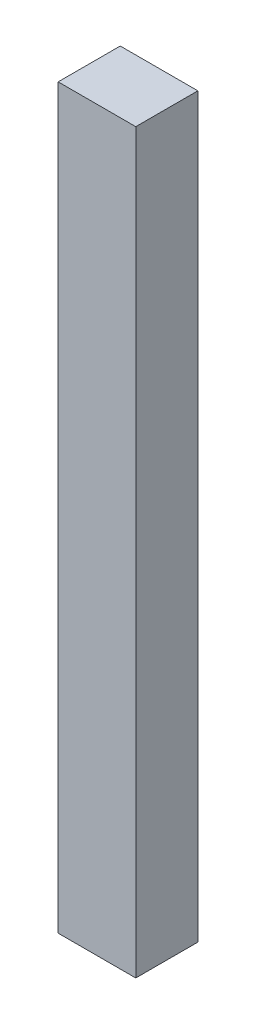
ISO-10303-21;
HEADER;
FILE_DESCRIPTION(('STEP AP214'),'2;1');
FILE_NAME('part.step','',(''),(''),'','','');
FILE_SCHEMA(('AUTOMOTIVE_DESIGN { 1 0 10303 214 1 1 1 1 }'));
ENDSEC;
DATA;
#1=APPLICATION_CONTEXT('core data for automotive mechanical design processes');
#2=APPLICATION_PROTOCOL_DEFINITION('international standard','automotive_design',2000,#1);
#3=PRODUCT_CONTEXT('',#1,'mechanical');
#4=PRODUCT('Part','Part','',(#3));
#5=PRODUCT_RELATED_PRODUCT_CATEGORY('part','',(#4));
#6=PRODUCT_DEFINITION_FORMATION('','',#4);
#7=PRODUCT_DEFINITION_CONTEXT('part definition',#1,'design');
#8=PRODUCT_DEFINITION('design','',#6,#7);
#9=PRODUCT_DEFINITION_SHAPE('','',#8);
#10=(LENGTH_UNIT() NAMED_UNIT(*) SI_UNIT(.MILLI.,.METRE.));
#11=(NAMED_UNIT(*) PLANE_ANGLE_UNIT() SI_UNIT($,.RADIAN.));
#12=(NAMED_UNIT(*) SI_UNIT($,.STERADIAN.) SOLID_ANGLE_UNIT());
#13=UNCERTAINTY_MEASURE_WITH_UNIT(LENGTH_MEASURE(1.E-05),#10,'distance_accuracy_value','');
#14=(GEOMETRIC_REPRESENTATION_CONTEXT(3) GLOBAL_UNCERTAINTY_ASSIGNED_CONTEXT((#13)) GLOBAL_UNIT_ASSIGNED_CONTEXT((#10,
#11,#12)) REPRESENTATION_CONTEXT('',''));
#15=CARTESIAN_POINT('',(0.,0.,0.));
#16=DIRECTION('',(0.,0.,1.));
#17=DIRECTION('',(1.,0.,0.));
#18=AXIS2_PLACEMENT_3D('',#15,#16,#17);
#19=CARTESIAN_POINT('',(-10.5586380739637,2.320984547896,3.540984547896));
#20=DIRECTION('',(0.,0.,-1.));
#21=DIRECTION('',(0.,1.,0.));
#22=AXIS2_PLACEMENT_3D('',#19,#20,#21);
#23=PLANE('',#22);
#24=DIRECTION('',(0.,1.,0.));
#25=VECTOR('',#24,1.);
#26=CARTESIAN_POINT('',(-10.1386380739637,2.130984547896,3.540984547896));
#27=LINE('',#26,#25);
#28=CARTESIAN_POINT('',(-10.1386380739637,-1.669015452104,3.540984547896));
#29=VERTEX_POINT('',#28);
#30=CARTESIAN_POINT('',(-10.1386380739637,2.130984547896,3.540984547896));
#31=VERTEX_POINT('',#30);
#32=EDGE_CURVE('E80',#29,#31,#27,.T.);
#33=ORIENTED_EDGE('',*,*,#32,.F.);
#34=DIRECTION('',(1.,0.,0.));
#35=VECTOR('',#34,1.);
#36=CARTESIAN_POINT('',(-10.1386380739637,-1.669015452104,3.540984547896));
#37=LINE('',#36,#35);
#38=CARTESIAN_POINT('',(-10.5386380739637,-1.669015452104,3.540984547896));
#39=VERTEX_POINT('',#38);
#40=EDGE_CURVE('E68',#39,#29,#37,.T.);
#41=ORIENTED_EDGE('',*,*,#40,.F.);
#42=DIRECTION('',(0.,-1.,0.));
#43=VECTOR('',#42,1.);
#44=CARTESIAN_POINT('',(-10.5386380739637,-1.669015452104,3.540984547896));
#45=LINE('',#44,#43);
#46=CARTESIAN_POINT('',(-10.5386380739637,2.130984547896,3.540984547896));
#47=VERTEX_POINT('',#46);
#48=EDGE_CURVE('E55',#47,#39,#45,.T.);
#49=ORIENTED_EDGE('',*,*,#48,.F.);
#50=DIRECTION('',(1.,0.,0.));
#51=VECTOR('',#50,1.);
#52=CARTESIAN_POINT('',(-10.5386380739637,2.130984547896,3.540984547896));
#53=LINE('',#52,#51);
#54=EDGE_CURVE('E20',#31,#47,#53,.F.);
#55=ORIENTED_EDGE('',*,*,#54,.F.);
#56=EDGE_LOOP('',(#33,#41,#49,#55));
#57=FACE_BOUND('',#56,.T.);
#58=ADVANCED_FACE('F17',(#57),#23,.T.);
#59=CARTESIAN_POINT('',(-10.5386380739637,2.130984547896,3.860984547896));
#60=DIRECTION('',(0.,1.,0.));
#61=DIRECTION('',(0.,0.,1.));
#62=AXIS2_PLACEMENT_3D('',#59,#60,#61);
#63=PLANE('',#62);
#64=ORIENTED_EDGE('',*,*,#54,.T.);
#65=DIRECTION('',(0.,0.,1.));
#66=VECTOR('',#65,1.);
#67=CARTESIAN_POINT('',(-10.5386380739637,2.130984547896,3.860984547896));
#68=LINE('',#67,#66);
#69=CARTESIAN_POINT('',(-10.5386380739637,2.130984547896,3.860984547896));
#70=VERTEX_POINT('',#69);
#71=EDGE_CURVE('E61',#70,#47,#68,.F.);
#72=ORIENTED_EDGE('',*,*,#71,.F.);
#73=DIRECTION('',(1.,0.,0.));
#74=VECTOR('',#73,1.);
#75=CARTESIAN_POINT('',(-10.5586380739637,2.130984547896,3.860984547896));
#76=LINE('',#75,#74);
#77=CARTESIAN_POINT('',(-10.1386380739637,2.130984547896,3.860984547896));
#78=VERTEX_POINT('',#77);
#79=EDGE_CURVE('E83',#78,#70,#76,.F.);
#80=ORIENTED_EDGE('',*,*,#79,.F.);
#81=DIRECTION('',(0.,0.,1.));
#82=VECTOR('',#81,1.);
#83=CARTESIAN_POINT('',(-10.1386380739637,2.130984547896,3.860984547896));
#84=LINE('',#83,#82);
#85=EDGE_CURVE('E64',#31,#78,#84,.T.);
#86=ORIENTED_EDGE('',*,*,#85,.F.);
#87=EDGE_LOOP('',(#64,#72,#80,#86));
#88=FACE_BOUND('',#87,.T.);
#89=ADVANCED_FACE('F60',(#88),#63,.T.);
#90=CARTESIAN_POINT('',(-10.5386380739637,-1.669015452104,3.860984547896));
#91=DIRECTION('',(-1.,0.,0.));
#92=DIRECTION('',(0.,-1.,0.));
#93=AXIS2_PLACEMENT_3D('',#90,#91,#92);
#94=PLANE('',#93);
#95=ORIENTED_EDGE('',*,*,#48,.T.);
#96=DIRECTION('',(0.,0.,-1.));
#97=VECTOR('',#96,1.);
#98=CARTESIAN_POINT('',(-10.5386380739637,-1.669015452104,3.860984547896));
#99=LINE('',#98,#97);
#100=CARTESIAN_POINT('',(-10.5386380739637,-1.669015452104,3.860984547896));
#101=VERTEX_POINT('',#100);
#102=EDGE_CURVE('E70',#101,#39,#99,.T.);
#103=ORIENTED_EDGE('',*,*,#102,.F.);
#104=DIRECTION('',(0.,-1.,0.));
#105=VECTOR('',#104,1.);
#106=CARTESIAN_POINT('',(-10.5386380739637,-1.859015452104,3.860984547896));
#107=LINE('',#106,#105);
#108=EDGE_CURVE('E74',#70,#101,#107,.T.);
#109=ORIENTED_EDGE('',*,*,#108,.F.);
#110=ORIENTED_EDGE('',*,*,#71,.T.);
#111=EDGE_LOOP('',(#95,#103,#109,#110));
#112=FACE_BOUND('',#111,.T.);
#113=ADVANCED_FACE('F72',(#112),#94,.T.);
#114=CARTESIAN_POINT('',(-10.1386380739637,-1.669015452104,3.860984547896));
#115=DIRECTION('',(0.,-1.,0.));
#116=DIRECTION('',(0.,0.,-1.));
#117=AXIS2_PLACEMENT_3D('',#114,#115,#116);
#118=PLANE('',#117);
#119=ORIENTED_EDGE('',*,*,#40,.T.);
#120=DIRECTION('',(0.,0.,1.));
#121=VECTOR('',#120,1.);
#122=CARTESIAN_POINT('',(-10.1386380739637,-1.669015452104,3.860984547896));
#123=LINE('',#122,#121);
#124=CARTESIAN_POINT('',(-10.1386380739637,-1.669015452104,3.860984547896));
#125=VERTEX_POINT('',#124);
#126=EDGE_CURVE('E35',#125,#29,#123,.F.);
#127=ORIENTED_EDGE('',*,*,#126,.F.);
#128=DIRECTION('',(1.,0.,0.));
#129=VECTOR('',#128,1.);
#130=CARTESIAN_POINT('',(-10.5586380739637,-1.669015452104,3.860984547896));
#131=LINE('',#130,#129);
#132=EDGE_CURVE('E26',#101,#125,#131,.T.);
#133=ORIENTED_EDGE('',*,*,#132,.F.);
#134=ORIENTED_EDGE('',*,*,#102,.T.);
#135=EDGE_LOOP('',(#119,#127,#133,#134));
#136=FACE_BOUND('',#135,.T.);
#137=ADVANCED_FACE('F89',(#136),#118,.T.);
#138=CARTESIAN_POINT('',(-10.1386380739637,2.130984547896,3.860984547896));
#139=DIRECTION('',(1.,0.,0.));
#140=DIRECTION('',(0.,1.,0.));
#141=AXIS2_PLACEMENT_3D('',#138,#139,#140);
#142=PLANE('',#141);
#143=ORIENTED_EDGE('',*,*,#32,.T.);
#144=ORIENTED_EDGE('',*,*,#85,.T.);
#145=DIRECTION('',(0.,-1.,0.));
#146=VECTOR('',#145,1.);
#147=CARTESIAN_POINT('',(-10.1386380739637,-1.859015452104,3.860984547896));
#148=LINE('',#147,#146);
#149=EDGE_CURVE('E11',#125,#78,#148,.F.);
#150=ORIENTED_EDGE('',*,*,#149,.F.);
#151=ORIENTED_EDGE('',*,*,#126,.T.);
#152=EDGE_LOOP('',(#143,#144,#150,#151));
#153=FACE_BOUND('',#152,.T.);
#154=ADVANCED_FACE('F91',(#153),#142,.T.);
#155=CARTESIAN_POINT('',(-10.5586380739637,-1.859015452104,3.860984547896));
#156=DIRECTION('',(0.,0.,1.));
#157=DIRECTION('',(0.,-1.,0.));
#158=AXIS2_PLACEMENT_3D('',#155,#156,#157);
#159=PLANE('',#158);
#160=ORIENTED_EDGE('',*,*,#132,.T.);
#161=ORIENTED_EDGE('',*,*,#149,.T.);
#162=ORIENTED_EDGE('',*,*,#79,.T.);
#163=ORIENTED_EDGE('',*,*,#108,.T.);
#164=EDGE_LOOP('',(#160,#161,#162,#163));
#165=FACE_BOUND('',#164,.T.);
#166=ADVANCED_FACE('F88',(#165),#159,.T.);
#167=CLOSED_SHELL('',(#58,#89,#113,#137,#154,#166));
#168=MANIFOLD_SOLID_BREP('B1',#167);
#169=ADVANCED_BREP_SHAPE_REPRESENTATION('',(#18,#168),#14);
#170=SHAPE_DEFINITION_REPRESENTATION(#9,#169);
ENDSEC;
END-ISO-10303-21;
